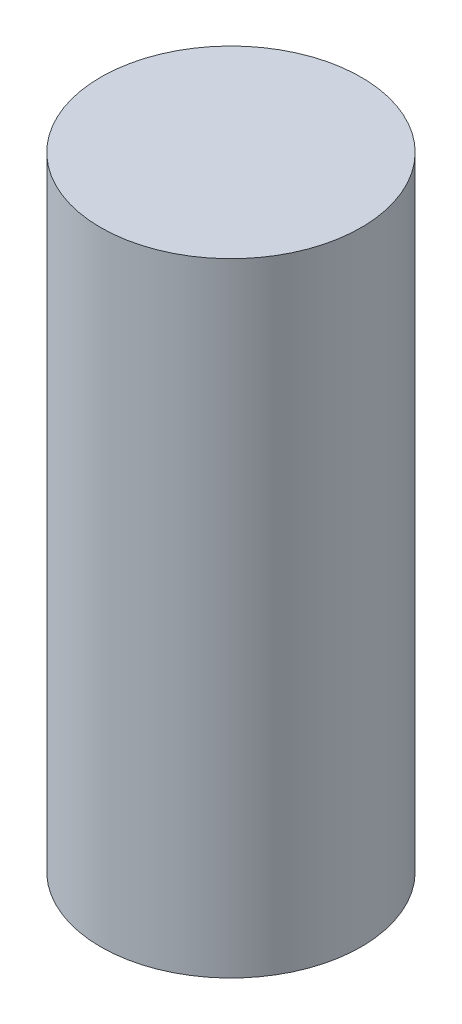
ISO-10303-21;
HEADER;
FILE_DESCRIPTION(('STEP AP214'),'2;1');
FILE_NAME('part.step','',(''),(''),'','','');
FILE_SCHEMA(('AUTOMOTIVE_DESIGN { 1 0 10303 214 1 1 1 1 }'));
ENDSEC;
DATA;
#1=APPLICATION_CONTEXT('core data for automotive mechanical design processes');
#2=APPLICATION_PROTOCOL_DEFINITION('international standard','automotive_design',2000,#1);
#3=PRODUCT_CONTEXT('',#1,'mechanical');
#4=PRODUCT('Part','Part','',(#3));
#5=PRODUCT_RELATED_PRODUCT_CATEGORY('part','',(#4));
#6=PRODUCT_DEFINITION_FORMATION('','',#4);
#7=PRODUCT_DEFINITION_CONTEXT('part definition',#1,'design');
#8=PRODUCT_DEFINITION('design','',#6,#7);
#9=PRODUCT_DEFINITION_SHAPE('','',#8);
#10=(LENGTH_UNIT() NAMED_UNIT(*) SI_UNIT(.MILLI.,.METRE.));
#11=(NAMED_UNIT(*) PLANE_ANGLE_UNIT() SI_UNIT($,.RADIAN.));
#12=(NAMED_UNIT(*) SI_UNIT($,.STERADIAN.) SOLID_ANGLE_UNIT());
#13=UNCERTAINTY_MEASURE_WITH_UNIT(LENGTH_MEASURE(1.E-05),#10,'distance_accuracy_value','');
#14=(GEOMETRIC_REPRESENTATION_CONTEXT(3) GLOBAL_UNCERTAINTY_ASSIGNED_CONTEXT((#13)) GLOBAL_UNIT_ASSIGNED_CONTEXT((#10,
#11,#12)) REPRESENTATION_CONTEXT('',''));
#15=CARTESIAN_POINT('',(0.,0.,0.));
#16=DIRECTION('',(0.,0.,1.));
#17=DIRECTION('',(1.,0.,0.));
#18=AXIS2_PLACEMENT_3D('',#15,#16,#17);
#19=CARTESIAN_POINT('',(0.,14.346,0.));
#20=DIRECTION('',(0.,-1.,0.));
#21=DIRECTION('',(0.,0.,-1.));
#22=AXIS2_PLACEMENT_3D('',#19,#20,#21);
#23=CYLINDRICAL_SURFACE('',#22,3.);
#24=CARTESIAN_POINT('',(0.,14.346,0.));
#25=DIRECTION('',(0.,1.,0.));
#26=DIRECTION('',(0.,0.,1.));
#27=AXIS2_PLACEMENT_3D('',#24,#25,#26);
#28=CIRCLE('',#27,3.);
#29=CARTESIAN_POINT('',(0.,14.346,3.));
#30=VERTEX_POINT('',#29);
#31=EDGE_CURVE('E10',#30,#30,#28,.T.);
#32=ORIENTED_EDGE('',*,*,#31,.F.);
#33=EDGE_LOOP('',(#32));
#34=FACE_BOUND('',#33,.T.);
#35=CARTESIAN_POINT('',(0.,0.,0.));
#36=DIRECTION('',(0.,1.,0.));
#37=DIRECTION('',(0.,0.,1.));
#38=AXIS2_PLACEMENT_3D('',#35,#36,#37);
#39=CIRCLE('',#38,3.);
#40=CARTESIAN_POINT('',(0.,0.,3.));
#41=VERTEX_POINT('',#40);
#42=EDGE_CURVE('E42',#41,#41,#39,.T.);
#43=ORIENTED_EDGE('',*,*,#42,.T.);
#44=EDGE_LOOP('',(#43));
#45=FACE_BOUND('',#44,.T.);
#46=ADVANCED_FACE('F39',(#34,#45),#23,.T.);
#47=CARTESIAN_POINT('',(0.,14.346,0.));
#48=DIRECTION('',(0.,1.,0.));
#49=DIRECTION('',(0.,0.,1.));
#50=AXIS2_PLACEMENT_3D('',#47,#48,#49);
#51=PLANE('',#50);
#52=ORIENTED_EDGE('',*,*,#31,.T.);
#53=EDGE_LOOP('',(#52));
#54=FACE_BOUND('',#53,.T.);
#55=ADVANCED_FACE('F54',(#54),#51,.T.);
#56=CARTESIAN_POINT('',(0.,0.,0.));
#57=DIRECTION('',(0.,1.,0.));
#58=DIRECTION('',(0.,0.,1.));
#59=AXIS2_PLACEMENT_3D('',#56,#57,#58);
#60=PLANE('',#59);
#61=ORIENTED_EDGE('',*,*,#42,.F.);
#62=EDGE_LOOP('',(#61));
#63=FACE_BOUND('',#62,.T.);
#64=ADVANCED_FACE('F52',(#63),#60,.F.);
#65=CLOSED_SHELL('',(#46,#55,#64));
#66=MANIFOLD_SOLID_BREP('B2',#65);
#67=ADVANCED_BREP_SHAPE_REPRESENTATION('',(#18,#66),#14);
#68=SHAPE_DEFINITION_REPRESENTATION(#9,#67);
ENDSEC;
END-ISO-10303-21;
